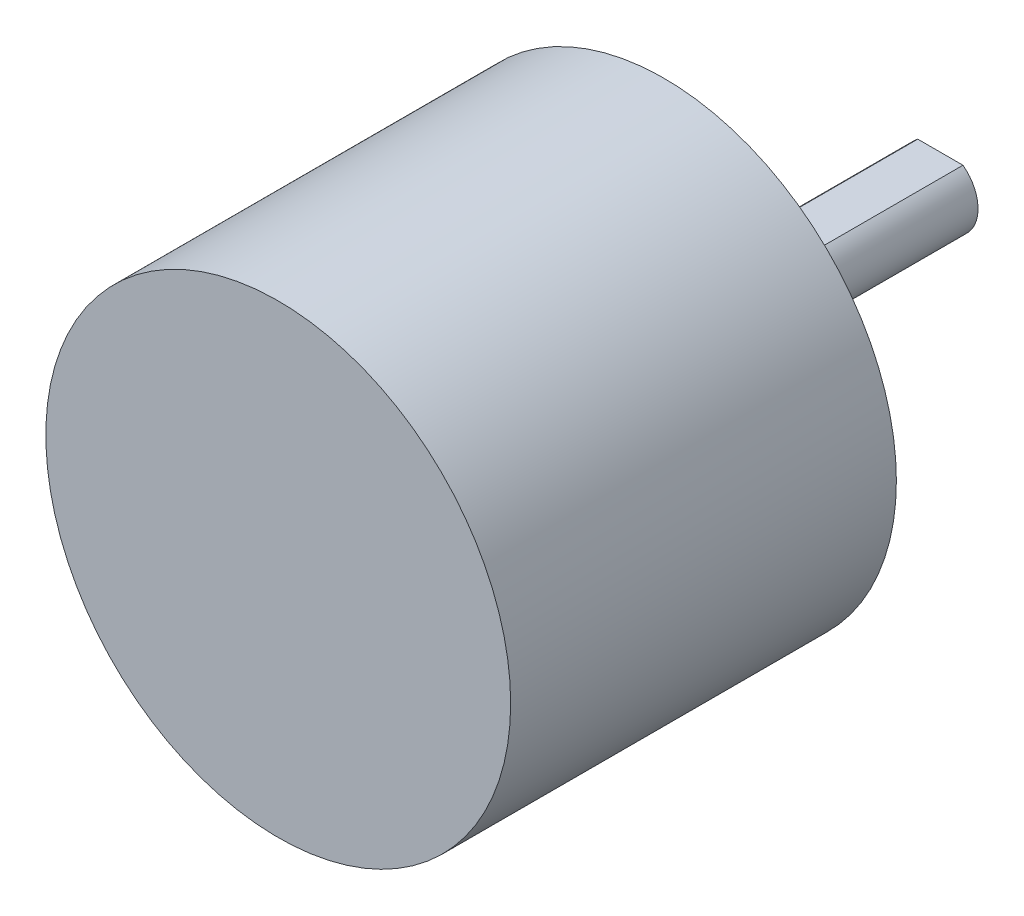
ISO-10303-21;
HEADER;
FILE_DESCRIPTION(('STEP AP214'),'2;1');
FILE_NAME('part.step','',(''),(''),'','','');
FILE_SCHEMA(('AUTOMOTIVE_DESIGN { 1 0 10303 214 1 1 1 1 }'));
ENDSEC;
DATA;
#1=APPLICATION_CONTEXT('core data for automotive mechanical design processes');
#2=APPLICATION_PROTOCOL_DEFINITION('international standard','automotive_design',2000,#1);
#3=PRODUCT_CONTEXT('',#1,'mechanical');
#4=PRODUCT('Part','Part','',(#3));
#5=PRODUCT_RELATED_PRODUCT_CATEGORY('part','',(#4));
#6=PRODUCT_DEFINITION_FORMATION('','',#4);
#7=PRODUCT_DEFINITION_CONTEXT('part definition',#1,'design');
#8=PRODUCT_DEFINITION('design','',#6,#7);
#9=PRODUCT_DEFINITION_SHAPE('','',#8);
#10=(LENGTH_UNIT() NAMED_UNIT(*) SI_UNIT(.MILLI.,.METRE.));
#11=(NAMED_UNIT(*) PLANE_ANGLE_UNIT() SI_UNIT($,.RADIAN.));
#12=(NAMED_UNIT(*) SI_UNIT($,.STERADIAN.) SOLID_ANGLE_UNIT());
#13=UNCERTAINTY_MEASURE_WITH_UNIT(LENGTH_MEASURE(1.E-05),#10,'distance_accuracy_value','');
#14=(GEOMETRIC_REPRESENTATION_CONTEXT(3) GLOBAL_UNCERTAINTY_ASSIGNED_CONTEXT((#13)) GLOBAL_UNIT_ASSIGNED_CONTEXT((#10,
#11,#12)) REPRESENTATION_CONTEXT('',''));
#15=CARTESIAN_POINT('',(0.,0.,0.));
#16=DIRECTION('',(0.,0.,1.));
#17=DIRECTION('',(1.,0.,0.));
#18=AXIS2_PLACEMENT_3D('',#15,#16,#17);
#19=CARTESIAN_POINT('',(0.,0.,30.7));
#20=DIRECTION('',(0.,0.,-1.));
#21=DIRECTION('',(-1.,0.,0.));
#22=AXIS2_PLACEMENT_3D('',#19,#20,#21);
#23=CYLINDRICAL_SURFACE('',#22,18.5);
#24=CARTESIAN_POINT('',(0.,0.,30.7));
#25=DIRECTION('',(0.,0.,1.));
#26=DIRECTION('',(1.,0.,0.));
#27=AXIS2_PLACEMENT_3D('',#24,#25,#26);
#28=CIRCLE('',#27,18.5);
#29=CARTESIAN_POINT('',(18.5,0.,30.7));
#30=VERTEX_POINT('',#29);
#31=EDGE_CURVE('E83',#30,#30,#28,.T.);
#32=ORIENTED_EDGE('',*,*,#31,.F.);
#33=EDGE_LOOP('',(#32));
#34=FACE_BOUND('',#33,.T.);
#35=CARTESIAN_POINT('',(0.,0.,0.));
#36=DIRECTION('',(0.,0.,1.));
#37=DIRECTION('',(1.,0.,0.));
#38=AXIS2_PLACEMENT_3D('',#35,#36,#37);
#39=CIRCLE('',#38,18.5);
#40=CARTESIAN_POINT('',(18.5,0.,0.));
#41=VERTEX_POINT('',#40);
#42=EDGE_CURVE('E40',#41,#41,#39,.T.);
#43=ORIENTED_EDGE('',*,*,#42,.T.);
#44=EDGE_LOOP('',(#43));
#45=FACE_BOUND('',#44,.T.);
#46=ADVANCED_FACE('F37',(#34,#45),#23,.T.);
#47=CARTESIAN_POINT('',(0.,0.,30.7));
#48=DIRECTION('',(0.,0.,1.));
#49=DIRECTION('',(1.,0.,0.));
#50=AXIS2_PLACEMENT_3D('',#47,#48,#49);
#51=PLANE('',#50);
#52=ORIENTED_EDGE('',*,*,#31,.T.);
#53=EDGE_LOOP('',(#52));
#54=FACE_BOUND('',#53,.T.);
#55=ADVANCED_FACE('F94',(#54),#51,.T.);
#56=CARTESIAN_POINT('',(0.,0.,0.));
#57=DIRECTION('',(0.,0.,1.));
#58=DIRECTION('',(1.,0.,0.));
#59=AXIS2_PLACEMENT_3D('',#56,#57,#58);
#60=PLANE('',#59);
#61=CARTESIAN_POINT('',(0.,0.,0.));
#62=DIRECTION('',(0.,0.,-1.));
#63=DIRECTION('',(-1.,0.,0.));
#64=AXIS2_PLACEMENT_3D('',#61,#62,#63);
#65=CIRCLE('',#64,5.);
#66=CARTESIAN_POINT('',(-5.,0.,0.));
#67=VERTEX_POINT('',#66);
#68=EDGE_CURVE('E45',#67,#67,#65,.T.);
#69=ORIENTED_EDGE('',*,*,#68,.F.);
#70=EDGE_LOOP('',(#69));
#71=FACE_BOUND('',#70,.T.);
#72=ORIENTED_EDGE('',*,*,#42,.F.);
#73=EDGE_LOOP('',(#72));
#74=FACE_BOUND('',#73,.T.);
#75=ADVANCED_FACE('F91',(#71,#74),#60,.F.);
#76=CARTESIAN_POINT('',(0.,0.,-6.));
#77=DIRECTION('',(0.,0.,1.));
#78=DIRECTION('',(1.,0.,0.));
#79=AXIS2_PLACEMENT_3D('',#76,#77,#78);
#80=CYLINDRICAL_SURFACE('',#79,5.);
#81=CARTESIAN_POINT('',(0.,0.,-6.));
#82=DIRECTION('',(0.,0.,-1.));
#83=DIRECTION('',(-1.,0.,0.));
#84=AXIS2_PLACEMENT_3D('',#81,#82,#83);
#85=CIRCLE('',#84,5.);
#86=CARTESIAN_POINT('',(-5.,0.,-6.));
#87=VERTEX_POINT('',#86);
#88=EDGE_CURVE('E67',#87,#87,#85,.T.);
#89=ORIENTED_EDGE('',*,*,#88,.F.);
#90=EDGE_LOOP('',(#89));
#91=FACE_BOUND('',#90,.T.);
#92=ORIENTED_EDGE('',*,*,#68,.T.);
#93=EDGE_LOOP('',(#92));
#94=FACE_BOUND('',#93,.T.);
#95=ADVANCED_FACE('F93',(#91,#94),#80,.T.);
#96=CARTESIAN_POINT('',(0.,0.,-6.));
#97=DIRECTION('',(0.,0.,-1.));
#98=DIRECTION('',(-1.,0.,0.));
#99=AXIS2_PLACEMENT_3D('',#96,#97,#98);
#100=PLANE('',#99);
#101=CARTESIAN_POINT('',(0.,0.,-6.));
#102=DIRECTION('',(0.,0.,-1.));
#103=DIRECTION('',(-1.,0.,0.));
#104=AXIS2_PLACEMENT_3D('',#101,#102,#103);
#105=CIRCLE('',#104,3.);
#106=CARTESIAN_POINT('',(1.8,2.4,-6.));
#107=VERTEX_POINT('',#106);
#108=CARTESIAN_POINT('',(-1.8,2.4,-6.));
#109=VERTEX_POINT('',#108);
#110=EDGE_CURVE('E11',#107,#109,#105,.T.);
#111=ORIENTED_EDGE('',*,*,#110,.F.);
#112=DIRECTION('',(-1.,0.,0.));
#113=VECTOR('',#112,1.);
#114=CARTESIAN_POINT('',(1.8,2.4,-6.00000000000001));
#115=LINE('',#114,#113);
#116=EDGE_CURVE('E74',#107,#109,#115,.T.);
#117=ORIENTED_EDGE('',*,*,#116,.T.);
#118=EDGE_LOOP('',(#111,#117));
#119=FACE_BOUND('',#118,.T.);
#120=ORIENTED_EDGE('',*,*,#88,.T.);
#121=EDGE_LOOP('',(#120));
#122=FACE_BOUND('',#121,.T.);
#123=ADVANCED_FACE('F100',(#119,#122),#100,.T.);
#124=CARTESIAN_POINT('',(0.,0.,-22.));
#125=DIRECTION('',(0.,0.,1.));
#126=DIRECTION('',(1.,0.,0.));
#127=AXIS2_PLACEMENT_3D('',#124,#125,#126);
#128=CYLINDRICAL_SURFACE('',#127,3.);
#129=CARTESIAN_POINT('',(0.,0.,-22.));
#130=DIRECTION('',(0.,0.,-1.));
#131=DIRECTION('',(-1.,0.,0.));
#132=AXIS2_PLACEMENT_3D('',#129,#130,#131);
#133=CIRCLE('',#132,3.);
#134=CARTESIAN_POINT('',(1.8,2.4,-22.));
#135=VERTEX_POINT('',#134);
#136=CARTESIAN_POINT('',(-1.8,2.4,-22.));
#137=VERTEX_POINT('',#136);
#138=EDGE_CURVE('E63',#135,#137,#133,.T.);
#139=ORIENTED_EDGE('',*,*,#138,.F.);
#140=DIRECTION('',(0.,0.,1.));
#141=VECTOR('',#140,1.);
#142=CARTESIAN_POINT('',(1.8,2.4,-180.706248106443));
#143=LINE('',#142,#141);
#144=EDGE_CURVE('E52',#135,#107,#143,.T.);
#145=ORIENTED_EDGE('',*,*,#144,.T.);
#146=ORIENTED_EDGE('',*,*,#110,.T.);
#147=DIRECTION('',(0.,0.,1.));
#148=VECTOR('',#147,1.);
#149=CARTESIAN_POINT('',(-1.8,2.4,-180.706248106443));
#150=LINE('',#149,#148);
#151=EDGE_CURVE('E70',#137,#109,#150,.T.);
#152=ORIENTED_EDGE('',*,*,#151,.F.);
#153=EDGE_LOOP('',(#139,#145,#146,#152));
#154=FACE_BOUND('',#153,.T.);
#155=ADVANCED_FACE('F71',(#154),#128,.T.);
#156=CARTESIAN_POINT('',(0.,0.,-22.));
#157=DIRECTION('',(0.,0.,-1.));
#158=DIRECTION('',(-1.,0.,0.));
#159=AXIS2_PLACEMENT_3D('',#156,#157,#158);
#160=PLANE('',#159);
#161=DIRECTION('',(-1.,0.,0.));
#162=VECTOR('',#161,1.);
#163=CARTESIAN_POINT('',(1.8,2.4,-22.));
#164=LINE('',#163,#162);
#165=EDGE_CURVE('E66',#135,#137,#164,.T.);
#166=ORIENTED_EDGE('',*,*,#165,.F.);
#167=ORIENTED_EDGE('',*,*,#138,.T.);
#168=EDGE_LOOP('',(#166,#167));
#169=FACE_BOUND('',#168,.T.);
#170=ADVANCED_FACE('F64',(#169),#160,.T.);
#171=CARTESIAN_POINT('',(1.8,2.4,-180.706248106443));
#172=DIRECTION('',(0.,1.,0.));
#173=DIRECTION('',(0.,0.,1.));
#174=AXIS2_PLACEMENT_3D('',#171,#172,#173);
#175=PLANE('',#174);
#176=ORIENTED_EDGE('',*,*,#144,.F.);
#177=ORIENTED_EDGE('',*,*,#165,.T.);
#178=ORIENTED_EDGE('',*,*,#151,.T.);
#179=ORIENTED_EDGE('',*,*,#116,.F.);
#180=EDGE_LOOP('',(#176,#177,#178,#179));
#181=FACE_BOUND('',#180,.T.);
#182=ADVANCED_FACE('F76',(#181),#175,.T.);
#183=CLOSED_SHELL('',(#46,#55,#75,#95,#123,#155,#170,#182));
#184=MANIFOLD_SOLID_BREP('B2',#183);
#185=ADVANCED_BREP_SHAPE_REPRESENTATION('',(#18,#184),#14);
#186=SHAPE_DEFINITION_REPRESENTATION(#9,#185);
ENDSEC;
END-ISO-10303-21;
